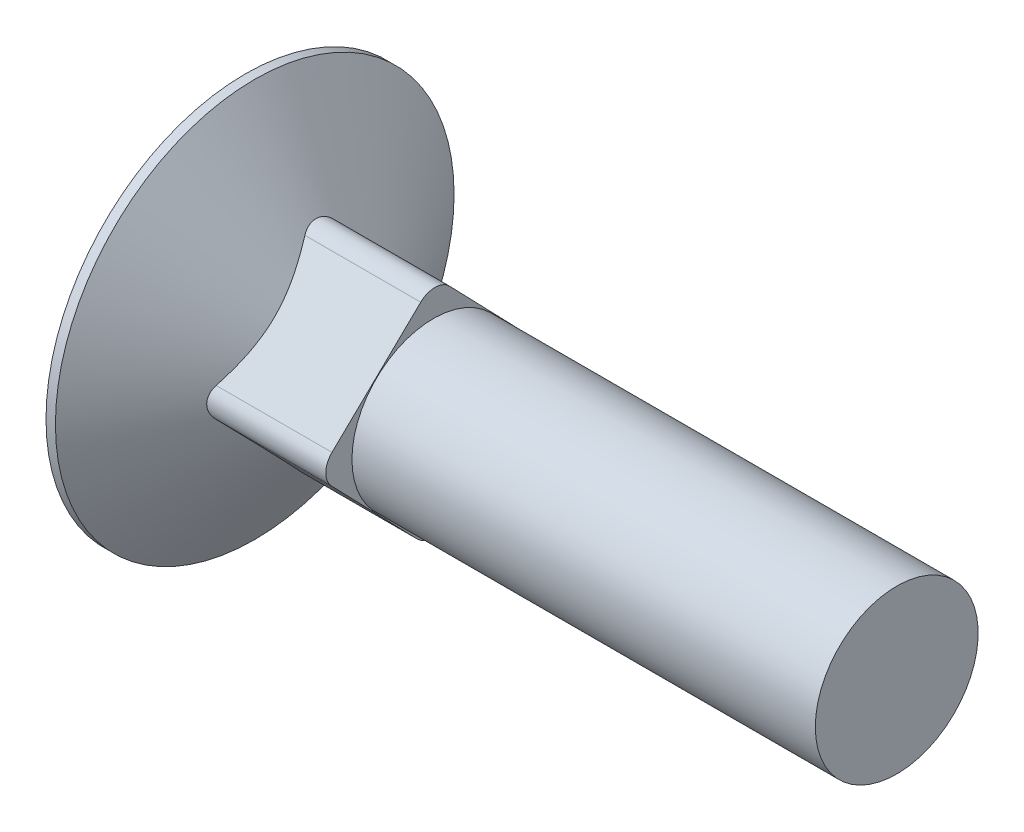
ISO-10303-21;
HEADER;
FILE_DESCRIPTION(('STEP AP214'),'2;1');
FILE_NAME('part.step','',(''),(''),'','','');
FILE_SCHEMA(('AUTOMOTIVE_DESIGN { 1 0 10303 214 1 1 1 1 }'));
ENDSEC;
DATA;
#1=APPLICATION_CONTEXT('core data for automotive mechanical design processes');
#2=APPLICATION_PROTOCOL_DEFINITION('international standard','automotive_design',2000,#1);
#3=PRODUCT_CONTEXT('',#1,'mechanical');
#4=PRODUCT('Part','Part','',(#3));
#5=PRODUCT_RELATED_PRODUCT_CATEGORY('part','',(#4));
#6=PRODUCT_DEFINITION_FORMATION('','',#4);
#7=PRODUCT_DEFINITION_CONTEXT('part definition',#1,'design');
#8=PRODUCT_DEFINITION('design','',#6,#7);
#9=PRODUCT_DEFINITION_SHAPE('','',#8);
#10=(LENGTH_UNIT() NAMED_UNIT(*) SI_UNIT(.MILLI.,.METRE.));
#11=(NAMED_UNIT(*) PLANE_ANGLE_UNIT() SI_UNIT($,.RADIAN.));
#12=(NAMED_UNIT(*) SI_UNIT($,.STERADIAN.) SOLID_ANGLE_UNIT());
#13=UNCERTAINTY_MEASURE_WITH_UNIT(LENGTH_MEASURE(1.E-05),#10,'distance_accuracy_value','');
#14=(GEOMETRIC_REPRESENTATION_CONTEXT(3) GLOBAL_UNCERTAINTY_ASSIGNED_CONTEXT((#13)) GLOBAL_UNIT_ASSIGNED_CONTEXT((#10,
#11,#12)) REPRESENTATION_CONTEXT('',''));
#15=CARTESIAN_POINT('',(0.,0.,0.));
#16=DIRECTION('',(0.,0.,1.));
#17=DIRECTION('',(1.,0.,0.));
#18=AXIS2_PLACEMENT_3D('',#15,#16,#17);
#19=CARTESIAN_POINT('',(0.550820296550669,0.,0.));
#20=DIRECTION('',(-1.,0.,0.));
#21=DIRECTION('',(0.,0.,1.));
#22=AXIS2_PLACEMENT_3D('',#19,#20,#21);
#23=CONICAL_SURFACE('',#22,11.6586,0.99483767363677);
#24=CARTESIAN_POINT('',(0.550820296550669,0.,0.));
#25=DIRECTION('',(-1.,0.,0.));
#26=DIRECTION('',(0.,0.,1.));
#27=AXIS2_PLACEMENT_3D('',#24,#25,#26);
#28=CIRCLE('',#27,11.6586);
#29=CARTESIAN_POINT('',(0.550820296550669,0.,11.6586));
#30=VERTEX_POINT('',#29);
#31=EDGE_CURVE('E133',#30,#30,#28,.T.);
#32=ORIENTED_EDGE('',*,*,#31,.F.);
#33=EDGE_LOOP('',(#32));
#34=FACE_BOUND('',#33,.T.);
#35=CARTESIAN_POINT('',(4.22248309683659,0.947568834934207,5.92949887114967));
#36=CARTESIAN_POINT('',(4.22248438139506,0.947571122348949,5.92949650246236));
#37=CARTESIAN_POINT('',(4.22248566595257,0.947573409763963,5.92949413377478));
#38=CARTESIAN_POINT('',(4.32284815381683,1.12628931816144,5.74442839307166));
#39=CARTESIAN_POINT('',(4.41731812936241,1.3066569752334,5.55765221654693));
#40=CARTESIAN_POINT('',(4.59027525263616,1.67116878949164,5.18018918314821));
#41=CARTESIAN_POINT('',(4.66875633483032,1.85531435081008,4.98950087225281));
#42=CARTESIAN_POINT('',(4.80418227689808,2.22697233379863,4.60463776450578));
#43=CARTESIAN_POINT('',(4.86118848153671,2.4144735375398,4.41047458415964));
#44=CARTESIAN_POINT('',(4.92662981337992,2.69789389232307,4.1169842152363));
#45=CARTESIAN_POINT('',(4.9450976620951,2.79271438242185,4.01879472337053));
#46=CARTESIAN_POINT('',(4.97481699163927,2.98289365180417,3.82185832487059));
#47=CARTESIAN_POINT('',(4.98606962730159,3.07825234247984,3.72311150999255));
#48=CARTESIAN_POINT('',(5.00156239145632,3.2766822108404,3.51763136614373));
#49=CARTESIAN_POINT('',(5.00518966349985,3.37977690077322,3.41087368952745));
#50=CARTESIAN_POINT('',(5.00348000544904,3.58593125786033,3.19739460344375));
#51=CARTESIAN_POINT('',(4.99814288955034,3.68899092424439,3.0906731947739));
#52=CARTESIAN_POINT('',(4.97871084625209,3.89476908505021,2.87758367134341));
#53=CARTESIAN_POINT('',(4.96461072221756,3.99748734064451,2.77121580389582));
#54=CARTESIAN_POINT('',(4.92818511680976,4.20220676501466,2.55922263413879));
#55=CARTESIAN_POINT('',(4.90585948067899,4.30420792026195,2.45359734583859));
#56=CARTESIAN_POINT('',(4.82748798957032,4.60941515972201,2.13754599738925));
#57=CARTESIAN_POINT('',(4.76011102909257,4.81123162421021,1.92855893058934));
#58=CARTESIAN_POINT('',(4.60229206329766,5.21026787820673,1.51534479327535));
#59=CARTESIAN_POINT('',(4.51185324666197,5.40748829908273,1.31111706896091));
#60=CARTESIAN_POINT('',(4.38274318829521,5.66239537127531,1.04715306850378));
#61=CARTESIAN_POINT('',(4.35166720856803,5.72199664545902,0.985434142345251));
#62=CARTESIAN_POINT('',(4.28810459207398,5.84077410652138,0.862436480822609));
#63=CARTESIAN_POINT('',(4.25561931990633,5.89995064268472,0.801157383763614));
#64=CARTESIAN_POINT('',(4.22248566595257,5.95895188124748,0.740059812676163));
#65=CARTESIAN_POINT('',(4.22248438139507,5.95895416866249,0.740057443988577));
#66=CARTESIAN_POINT('',(4.22248309683659,5.95895645607724,0.740055075301267));
#67=B_SPLINE_CURVE_WITH_KNOTS('',3,(#35,#36,#37,#38,#39,#40,#41,#42,#43,#44,#45,#46,#47,#48,#49,
#50,#51,#52,#53,#54,#55,#56,#57,#58,#59,#60,#61,#62,#63,#64,#65,#66),.UNSPECIFIED.,.F.,.F.,(4,2,
2,2,2,2,2,2,2,2,2,2,2,2,2,4),(0.,1.06036468604736E-05,0.828463634981272,1.65723036477948,
2.48361137065492,2.8966779658123,3.30967843094334,3.75477135228309,4.19987349915276,
4.6452398524854,5.09061458551495,5.98392039878694,6.87710276472493,7.15086040485315,
7.42435864042589,7.42436924407275),.UNSPECIFIED.);
#68=CARTESIAN_POINT('',(4.22259540928127,0.947768834934207,5.92929176508691));
#69=VERTEX_POINT('',#68);
#70=CARTESIAN_POINT('',(4.22259540928127,5.95875645607724,0.740262181364026));
#71=VERTEX_POINT('',#70);
#72=EDGE_CURVE('E47',#69,#71,#67,.T.);
#73=ORIENTED_EDGE('',*,*,#72,.T.);
#74=CARTESIAN_POINT('',(4.37014721321593,5.69985032690685,0.943136150924053));
#75=CARTESIAN_POINT('',(4.34324227212444,5.74630541437878,0.916161349937305));
#76=CARTESIAN_POINT('',(4.31737057595436,5.79141573778635,0.88572680002641));
#77=CARTESIAN_POINT('',(4.26806164216552,5.87802608257788,0.818098667074905));
#78=CARTESIAN_POINT('',(4.24463327878195,5.91951286021072,0.78088170840586));
#79=CARTESIAN_POINT('',(4.19884349338471,6.00105230453256,0.696483477664649));
#80=CARTESIAN_POINT('',(4.17675768151969,6.04065700764636,0.648713363506464));
#81=CARTESIAN_POINT('',(4.13679130178195,6.11255311127426,0.546442113838339));
#82=CARTESIAN_POINT('',(4.11890635436872,6.14485212689749,0.491948079487483));
#83=CARTESIAN_POINT('',(4.08784061693062,6.20089078040594,0.377146542352399));
#84=CARTESIAN_POINT('',(4.074680426633,6.22459294088776,0.316815003971383));
#85=CARTESIAN_POINT('',(4.0536865748734,6.2620253590223,0.192230504383717));
#86=CARTESIAN_POINT('',(4.04585257163797,6.27575625651985,0.127977795081107));
#87=CARTESIAN_POINT('',(4.03616202084214,6.2919412068429,0.00178023868278876));
#88=CARTESIAN_POINT('',(4.03395935709815,6.29505240748375,-0.0600542532917454));
#89=CARTESIAN_POINT('',(4.03460704892916,6.29166788865208,-0.183425580098465));
#90=CARTESIAN_POINT('',(4.03745634749913,6.28517417882969,-0.244962474494887));
#91=CARTESIAN_POINT('',(4.04790597437062,6.26328268852452,-0.363741134377618));
#92=CARTESIAN_POINT('',(4.05533558693759,6.24820628105391,-0.421057842102524));
#93=CARTESIAN_POINT('',(4.07452576779975,6.21006900852314,-0.532164216865608));
#94=CARTESIAN_POINT('',(4.08628534953391,6.18700996233741,-0.585954684053149));
#95=CARTESIAN_POINT('',(4.11572201771637,6.13004206716123,-0.696108824797507));
#96=CARTESIAN_POINT('',(4.13400145163864,6.09505887394084,-0.751757282500954));
#97=CARTESIAN_POINT('',(4.17510500418738,6.01742466311289,-0.855657395748282));
#98=CARTESIAN_POINT('',(4.19794009262019,5.97475516178265,-0.903890689678223));
#99=CARTESIAN_POINT('',(4.25129812881806,5.87636510602433,-0.998850151285309));
#100=CARTESIAN_POINT('',(4.28246388522523,5.81964672118477,-1.04418915426169));
#101=CARTESIAN_POINT('',(4.33216270300526,5.73066092924312,-1.10327230971032));
#102=CARTESIAN_POINT('',(4.34919495974103,5.7003924024824,-1.12146002525783));
#103=CARTESIAN_POINT('',(4.38413814474458,5.63879812941363,-1.15489504509219));
#104=CARTESIAN_POINT('',(4.40204831017735,5.60747330808014,-1.17014484731422));
#105=CARTESIAN_POINT('',(4.42035485245712,5.57572696349052,-1.18394128932733));
#106=B_SPLINE_CURVE_WITH_KNOTS('',3,(#74,#75,#76,#77,#78,#79,#80,#81,#82,#83,#84,#85,#86,#87,
#88,#89,#90,#91,#92,#93,#94,#95,#96,#97,#98,#99,#100,#101,#102,#103,#104,#105),.UNSPECIFIED.,
.F.,.F.,(4,2,2,2,2,2,2,2,2,2,2,2,2,2,2,4),(0.,0.180192585993531,0.361018374179981,
0.557766934637586,0.754309458634945,0.951698780586998,1.14907543516667,1.33399245257038,
1.51887078497551,1.69724330079825,1.87557520049025,2.07917372285048,2.28326855055709,
2.51893298149347,2.63643899183836,2.75384464847378),.UNSPECIFIED.);
#107=CARTESIAN_POINT('',(4.22259540928127,5.92929176508691,-0.947768834934208));
#108=VERTEX_POINT('',#107);
#109=EDGE_CURVE('E11',#71,#108,#106,.T.);
#110=ORIENTED_EDGE('',*,*,#109,.T.);
#111=CARTESIAN_POINT('',(0.495681040585581,11.044280820523,3.99171867916148));
#112=CARTESIAN_POINT('',(0.659605593270352,10.8452862852902,3.79955189023921));
#113=CARTESIAN_POINT('',(0.822787116952921,10.6459718954734,3.60707622133557));
#114=CARTESIAN_POINT('',(1.14720943469648,10.2465056021159,3.22131610592646));
#115=CARTESIAN_POINT('',(1.30845006491356,10.0463536297648,3.02803159297149));
#116=CARTESIAN_POINT('',(1.62912676478979,9.64427218477825,2.6397460549898));
#117=CARTESIAN_POINT('',(1.78855345174969,9.44233883206295,2.44474128301347));
#118=CARTESIAN_POINT('',(2.10426994280604,9.03721561056975,2.05351833560382));
#119=CARTESIAN_POINT('',(2.26055987044069,8.83402579169047,1.85730020835701));
#120=CARTESIAN_POINT('',(2.5809664770248,8.41032088945218,1.44813314043476));
#121=CARTESIAN_POINT('',(2.74475756497043,8.18967785640475,1.23506064018147));
#122=CARTESIAN_POINT('',(3.06594554778694,7.74595132420984,0.806558908956774));
#123=CARTESIAN_POINT('',(3.22334159948062,7.5228675081384,0.591129371935464));
#124=CARTESIAN_POINT('',(3.52896747014695,7.07387869176044,0.157545911945348));
#125=CARTESIAN_POINT('',(3.67721157511006,6.84797878581161,-0.0606030914594106));
#126=CARTESIAN_POINT('',(3.88995700175553,6.50605627837741,-0.390793818742508));
#127=CARTESIAN_POINT('',(3.95926260525405,6.39158094371092,-0.501341364422219));
#128=CARTESIAN_POINT('',(4.0939884470475,6.16145651958775,-0.723569937606912));
#129=CARTESIAN_POINT('',(4.15940896956308,6.0458075167196,-0.835250881494311));
#130=CARTESIAN_POINT('',(4.27305421121508,5.83624577241366,-1.03762230559955));
#131=CARTESIAN_POINT('',(4.32211697007454,5.74256862930014,-1.12808527116028));
#132=CARTESIAN_POINT('',(4.41671780322098,5.55430899870794,-1.30988548317248));
#133=CARTESIAN_POINT('',(4.46225634678265,5.45972663365729,-1.4012226113966));
#134=CARTESIAN_POINT('',(4.54924236238918,5.26958492621445,-1.5848403238968));
#135=CARTESIAN_POINT('',(4.59068982838876,5.17402558237884,-1.67712090956679));
#136=CARTESIAN_POINT('',(4.66886558930839,4.98187158797548,-1.86268186499645));
#137=CARTESIAN_POINT('',(4.70559160483757,4.88527646155764,-1.95596269427923));
#138=CARTESIAN_POINT('',(4.80638749516394,4.59741609245913,-2.23394622142948));
#139=CARTESIAN_POINT('',(4.86268595006732,4.40465761067181,-2.42009092354035));
#140=CARTESIAN_POINT('',(4.92734090813,4.11332934835743,-2.7014233562414));
#141=CARTESIAN_POINT('',(4.94559284681815,4.01586576184731,-2.79554284768666));
#142=CARTESIAN_POINT('',(4.97498416381651,3.82039062156011,-2.98431099641585));
#143=CARTESIAN_POINT('',(4.98612475118575,3.72237916379107,-3.07895956098589));
#144=CARTESIAN_POINT('',(5.00155201998298,3.51777026607202,-3.27654807673882));
#145=CARTESIAN_POINT('',(5.00518048121502,3.41114669757963,-3.3795132599618));
#146=CARTESIAN_POINT('',(5.00349577655758,3.19794970444493,-3.5853952030546));
#147=CARTESIAN_POINT('',(4.99818364465874,3.09137627542973,-3.68831196714728));
#148=CARTESIAN_POINT('',(4.97882504967027,2.87858172590384,-3.89380527496456));
#149=CARTESIAN_POINT('',(4.96477348937265,2.77236084738888,-3.9963815849966));
#150=CARTESIAN_POINT('',(4.92846492200668,2.56065545050578,-4.20082311033268));
#151=CARTESIAN_POINT('',(4.90620752825576,2.45517096707743,-4.30268829189577));
#152=CARTESIAN_POINT('',(4.82792355120154,2.13896530825003,-4.60804454715587));
#153=CARTESIAN_POINT('',(4.76050815914816,1.9296878617625,-4.81014142804916));
#154=CARTESIAN_POINT('',(4.60253889844864,1.51590187615352,-5.20972990952423));
#155=CARTESIAN_POINT('',(4.51198767176197,1.31139279542414,-5.40722203313071));
#156=CARTESIAN_POINT('',(4.38271157994658,1.047088171023,-5.66245804204449));
#157=CARTESIAN_POINT('',(4.35160275952971,0.985305379627326,-5.72212099017154));
#158=CARTESIAN_POINT('',(4.28803700423806,0.862309749354663,-5.84089648967618));
#159=CARTESIAN_POINT('',(4.2555844165455,0.801095753712041,-5.90001015812935));
#160=CARTESIAN_POINT('',(4.12371643932472,0.557923852901268,-6.13483853309081));
#161=CARTESIAN_POINT('',(4.01920287406725,0.377392309263706,-6.3091758182802));
#162=CARTESIAN_POINT('',(3.80165547976134,0.0189931305149182,-6.65527788209797));
#163=CARTESIAN_POINT('',(3.68861970542927,-0.15887388521588,-6.82704206259764));
#164=CARTESIAN_POINT('',(3.45601586715288,-0.512631422361394,-7.16866174522246));
#165=CARTESIAN_POINT('',(3.33644025374842,-0.688519364329062,-7.33851475640456));
#166=CARTESIAN_POINT('',(3.09241622682978,-1.0385100795917,-7.67649686142038));
#167=CARTESIAN_POINT('',(2.96796822983632,-1.21261300388207,-7.84462610106868));
#168=CARTESIAN_POINT('',(2.71352006285851,-1.56181965907238,-8.1818510480739));
#169=CARTESIAN_POINT('',(2.58346651806181,-1.73690320914336,-8.35092726703081));
#170=CARTESIAN_POINT('',(2.3203053943893,-2.08588411042287,-8.68793420601848));
#171=CARTESIAN_POINT('',(2.18719770436412,-2.25978141816081,-8.85586488407019));
#172=CARTESIAN_POINT('',(1.91895844977538,-2.60609020260489,-9.19029138982492));
#173=CARTESIAN_POINT('',(1.78383404226921,-2.77850455377696,-9.35678999336743));
#174=CARTESIAN_POINT('',(1.51163147270664,-3.12251335868479,-9.68899543470172));
#175=CARTESIAN_POINT('',(1.37455348771856,-3.29410788486896,-9.85470234245612));
#176=CARTESIAN_POINT('',(1.23671318175408,-3.46538144504418,-10.0200992969386));
#177=B_SPLINE_CURVE_WITH_KNOTS('',3,(#111,#112,#113,#114,#115,#116,#117,#118,#119,#120,#121,
#122,#123,#124,#125,#126,#127,#128,#129,#130,#131,#132,#133,#134,#135,#136,#137,#138,#139,#140,
#141,#142,#143,#144,#145,#146,#147,#148,#149,#150,#151,#152,#153,#154,#155,#156,#157,#158,#159,
#160,#161,#162,#163,#164,#165,#166,#167,#168,#169,#170,#171,#172,#173,#174,#175,#176),
.UNSPECIFIED.,.F.,.F.,(4,2,2,2,2,2,2,2,2,2,2,2,2,2,2,2,2,2,2,2,2,2,2,2,2,2,2,2,2,2,2,2,4),(0.,
0.964671927295264,1.92942472588234,2.89790611186204,3.86634928000356,4.90945835241618,
5.9527045140249,6.99427871749752,7.51496760216722,8.03561834778448,8.45306191055756,
8.87044979172526,9.28783828964721,9.70542754093602,10.5255878267223,10.935577093343,
11.3454966357539,11.790031789242,12.2345155352235,12.6792587665354,13.1240229581116,
14.018526544747,14.9129280306001,15.1869685485165,15.4601828644386,16.275517718679,
17.0910392484204,17.9075229307919,18.7239369669677,19.551795107665,20.3796834245033,
21.2051211470469,22.0304845234866),.UNSPECIFIED.);
#178=CARTESIAN_POINT('',(4.22259540928127,0.740262181364026,-5.95875645607724));
#179=VERTEX_POINT('',#178);
#180=EDGE_CURVE('E138',#108,#179,#177,.T.);
#181=ORIENTED_EDGE('',*,*,#180,.T.);
#182=CARTESIAN_POINT('',(4.37014721321593,0.943136150924055,-5.69985032690685));
#183=CARTESIAN_POINT('',(4.34324227212444,0.916161349937306,-5.74630541437877));
#184=CARTESIAN_POINT('',(4.31737057595436,0.885726800026411,-5.79141573778635));
#185=CARTESIAN_POINT('',(4.26806164216552,0.818098667074907,-5.87802608257788));
#186=CARTESIAN_POINT('',(4.24463327878195,0.780881708405861,-5.91951286021072));
#187=CARTESIAN_POINT('',(4.19884349338471,0.69648347766465,-6.00105230453256));
#188=CARTESIAN_POINT('',(4.17675768151969,0.648713363506465,-6.04065700764636));
#189=CARTESIAN_POINT('',(4.13679130178195,0.54644211383834,-6.11255311127426));
#190=CARTESIAN_POINT('',(4.11890635436873,0.491948079487484,-6.14485212689748));
#191=CARTESIAN_POINT('',(4.08784061693062,0.377146542352399,-6.20089078040594));
#192=CARTESIAN_POINT('',(4.07468042663301,0.316815003971384,-6.22459294088776));
#193=CARTESIAN_POINT('',(4.0536865748734,0.192230504383717,-6.26202535902229));
#194=CARTESIAN_POINT('',(4.04585257163797,0.127977795081107,-6.27575625651985));
#195=CARTESIAN_POINT('',(4.03616202084214,0.00178023868278865,-6.2919412068429));
#196=CARTESIAN_POINT('',(4.03395935709815,-0.0600542532917456,-6.29505240748375));
#197=CARTESIAN_POINT('',(4.03460704892917,-0.183425580098465,-6.29166788865207));
#198=CARTESIAN_POINT('',(4.03745634749913,-0.244962474494887,-6.28517417882969));
#199=CARTESIAN_POINT('',(4.04790597437063,-0.363741134377618,-6.26328268852452));
#200=CARTESIAN_POINT('',(4.05533558693759,-0.421057842102524,-6.2482062810539));
#201=CARTESIAN_POINT('',(4.07452576779975,-0.532164216865608,-6.21006900852314));
#202=CARTESIAN_POINT('',(4.08628534953391,-0.58595468405315,-6.18700996233741));
#203=CARTESIAN_POINT('',(4.11572201771637,-0.696108824797508,-6.13004206716123));
#204=CARTESIAN_POINT('',(4.13400145163864,-0.751757282500954,-6.09505887394084));
#205=CARTESIAN_POINT('',(4.17510500418738,-0.855657395748282,-6.01742466311289));
#206=CARTESIAN_POINT('',(4.19794009262019,-0.903890689678222,-5.97475516178265));
#207=CARTESIAN_POINT('',(4.25129812881806,-0.998850151285309,-5.87636510602433));
#208=CARTESIAN_POINT('',(4.28246388522523,-1.04418915426169,-5.81964672118477));
#209=CARTESIAN_POINT('',(4.33216270300526,-1.10327230971032,-5.73066092924312));
#210=CARTESIAN_POINT('',(4.34919495974103,-1.12146002525783,-5.7003924024824));
#211=CARTESIAN_POINT('',(4.38413814474458,-1.15489504509219,-5.63879812941363));
#212=CARTESIAN_POINT('',(4.40204831017735,-1.17014484731422,-5.60747330808014));
#213=CARTESIAN_POINT('',(4.42035485245712,-1.18394128932733,-5.57572696349052));
#214=B_SPLINE_CURVE_WITH_KNOTS('',3,(#182,#183,#184,#185,#186,#187,#188,#189,#190,#191,#192,
#193,#194,#195,#196,#197,#198,#199,#200,#201,#202,#203,#204,#205,#206,#207,#208,#209,#210,#211,
#212,#213),.UNSPECIFIED.,.F.,.F.,(4,2,2,2,2,2,2,2,2,2,2,2,2,2,2,4),(0.,0.180192585993531,
0.361018374179982,0.557766934637587,0.754309458634947,0.951698780587,1.14907543516667,
1.33399245257038,1.51887078497551,1.69724330079826,1.87557520049025,2.07917372285048,
2.28326855055709,2.51893298149347,2.63643899183836,2.75384464847379),.UNSPECIFIED.);
#215=CARTESIAN_POINT('',(4.22259540928127,-0.947768834934208,-5.92929176508691));
#216=VERTEX_POINT('',#215);
#217=EDGE_CURVE('E147',#179,#216,#214,.T.);
#218=ORIENTED_EDGE('',*,*,#217,.T.);
#219=CARTESIAN_POINT('',(4.22248309683659,-0.947568834934208,-5.92949887114967));
#220=CARTESIAN_POINT('',(4.22248438139506,-0.94757112234895,-5.92949650246236));
#221=CARTESIAN_POINT('',(4.22248566595257,-0.947573409763963,-5.92949413377478));
#222=CARTESIAN_POINT('',(4.32284815382542,-1.12628931816263,-5.7444283930784));
#223=CARTESIAN_POINT('',(4.41731812936435,-1.30665697523301,-5.55765221654947));
#224=CARTESIAN_POINT('',(4.59027525263315,-1.67116878948976,-5.18018918314803));
#225=CARTESIAN_POINT('',(4.66875633482902,-1.8553143508083,-4.9895008722541));
#226=CARTESIAN_POINT('',(4.80418227689823,-2.22697233379726,-4.60463776450776));
#227=CARTESIAN_POINT('',(4.86118848153655,-2.41447353753876,-4.41047458416081));
#228=CARTESIAN_POINT('',(4.92662981337975,-2.69789389232254,-4.1169842152368));
#229=CARTESIAN_POINT('',(4.94509766209501,-2.79271438242143,-4.01879472337095));
#230=CARTESIAN_POINT('',(4.97481699163926,-2.98289365180397,-3.82185832487081));
#231=CARTESIAN_POINT('',(4.98606962730159,-3.07825234247974,-3.72311150999266));
#232=CARTESIAN_POINT('',(5.00156239145633,-3.27668221084056,-3.51763136614355));
#233=CARTESIAN_POINT('',(5.00518966349986,-3.37977690077355,-3.41087368952711));
#234=CARTESIAN_POINT('',(5.00348000544902,-3.58593125786099,-3.19739460344306));
#235=CARTESIAN_POINT('',(4.99814288955029,-3.68899092424523,-3.09067319477304));
#236=CARTESIAN_POINT('',(4.97871084625195,-3.89476908505143,-2.87758367134214));
#237=CARTESIAN_POINT('',(4.96461072221736,-3.99748734064594,-2.77121580389432));
#238=CARTESIAN_POINT('',(4.92818511680938,-4.20220676501653,-2.55922263413686));
#239=CARTESIAN_POINT('',(4.9058594806785,-4.30420792026405,-2.45359734583646));
#240=CARTESIAN_POINT('',(4.82748798956975,-4.60941515972387,-2.13754599738723));
#241=CARTESIAN_POINT('',(4.76011102909221,-4.81123162421153,-1.92855893058749));
#242=CARTESIAN_POINT('',(4.60229206329713,-5.21026787820766,-1.51534479327486));
#243=CARTESIAN_POINT('',(4.51185324666106,-5.40748829908381,-1.31111706896161));
#244=CARTESIAN_POINT('',(4.38274318829544,-5.66239537127508,-1.04715306850347));
#245=CARTESIAN_POINT('',(4.35166720856861,-5.72199664545844,-0.985434142344444));
#246=CARTESIAN_POINT('',(4.28810459207344,-5.8407741065219,-0.862436480823475));
#247=CARTESIAN_POINT('',(4.25561931990431,-5.89995064268669,-0.801157383766643));
#248=CARTESIAN_POINT('',(4.22248566595257,-5.95895188124748,-0.740059812676164));
#249=CARTESIAN_POINT('',(4.22248438139507,-5.95895416866249,-0.740057443988577));
#250=CARTESIAN_POINT('',(4.22248309683659,-5.95895645607724,-0.740055075301267));
#251=B_SPLINE_CURVE_WITH_KNOTS('',3,(#219,#220,#221,#222,#223,#224,#225,#226,#227,#228,#229,
#230,#231,#232,#233,#234,#235,#236,#237,#238,#239,#240,#241,#242,#243,#244,#245,#246,#247,#248,
#249,#250),.UNSPECIFIED.,.F.,.F.,(4,2,2,2,2,2,2,2,2,2,2,2,2,2,2,4),(0.,1.06036468595415E-05,
0.82846363497939,1.65723036477667,2.483611370654,2.89667796581186,3.30967843094333,
3.7547713522838,4.1998734991542,4.64523985248779,5.0906145855183,5.98392039878863,
6.87710276472493,7.15086040485309,7.42435864042589,7.42436924407275),.UNSPECIFIED.);
#252=CARTESIAN_POINT('',(4.22259540928127,-5.95875645607724,-0.740262181364027));
#253=VERTEX_POINT('',#252);
#254=EDGE_CURVE('E173',#216,#253,#251,.T.);
#255=ORIENTED_EDGE('',*,*,#254,.T.);
#256=CARTESIAN_POINT('',(4.37014721321593,-5.69985032690685,-0.943136150924055));
#257=CARTESIAN_POINT('',(4.34324227212444,-5.74630541437878,-0.916161349937306));
#258=CARTESIAN_POINT('',(4.31737057595436,-5.79141573778635,-0.885726800026411));
#259=CARTESIAN_POINT('',(4.26806164216552,-5.87802608257788,-0.818098667074906));
#260=CARTESIAN_POINT('',(4.24463327878195,-5.91951286021072,-0.780881708405861));
#261=CARTESIAN_POINT('',(4.19884349338471,-6.00105230453256,-0.69648347766465));
#262=CARTESIAN_POINT('',(4.17675768151969,-6.04065700764636,-0.648713363506465));
#263=CARTESIAN_POINT('',(4.13679130178195,-6.11255311127426,-0.54644211383834));
#264=CARTESIAN_POINT('',(4.11890635436872,-6.14485212689749,-0.491948079487484));
#265=CARTESIAN_POINT('',(4.08784061693062,-6.20089078040594,-0.377146542352399));
#266=CARTESIAN_POINT('',(4.07468042663301,-6.22459294088776,-0.316815003971384));
#267=CARTESIAN_POINT('',(4.0536865748734,-6.2620253590223,-0.192230504383717));
#268=CARTESIAN_POINT('',(4.04585257163797,-6.27575625651985,-0.127977795081108));
#269=CARTESIAN_POINT('',(4.03616202084214,-6.2919412068429,-0.00178023868278952));
#270=CARTESIAN_POINT('',(4.03395935709815,-6.29505240748375,0.0600542532917447));
#271=CARTESIAN_POINT('',(4.03460704892916,-6.29166788865208,0.183425580098464));
#272=CARTESIAN_POINT('',(4.03745634749913,-6.28517417882969,0.244962474494886));
#273=CARTESIAN_POINT('',(4.04790597437062,-6.26328268852452,0.363741134377618));
#274=CARTESIAN_POINT('',(4.05533558693758,-6.24820628105391,0.421057842102523));
#275=CARTESIAN_POINT('',(4.07452576779975,-6.21006900852314,0.532164216865608));
#276=CARTESIAN_POINT('',(4.08628534953391,-6.18700996233741,0.585954684053149));
#277=CARTESIAN_POINT('',(4.11572201771637,-6.13004206716123,0.696108824797507));
#278=CARTESIAN_POINT('',(4.13400145163864,-6.09505887394084,0.751757282500954));
#279=CARTESIAN_POINT('',(4.17510500418737,-6.01742466311289,0.855657395748282));
#280=CARTESIAN_POINT('',(4.19794009262019,-5.97475516178265,0.903890689678223));
#281=CARTESIAN_POINT('',(4.25129812881806,-5.87636510602433,0.998850151285309));
#282=CARTESIAN_POINT('',(4.28246388522523,-5.81964672118477,1.04418915426169));
#283=CARTESIAN_POINT('',(4.33216270300526,-5.73066092924312,1.10327230971032));
#284=CARTESIAN_POINT('',(4.34919495974103,-5.7003924024824,1.12146002525783));
#285=CARTESIAN_POINT('',(4.38413814474458,-5.63879812941363,1.15489504509219));
#286=CARTESIAN_POINT('',(4.40204831017735,-5.60747330808014,1.17014484731422));
#287=CARTESIAN_POINT('',(4.42035485245711,-5.57572696349052,1.18394128932733));
#288=B_SPLINE_CURVE_WITH_KNOTS('',3,(#256,#257,#258,#259,#260,#261,#262,#263,#264,#265,#266,
#267,#268,#269,#270,#271,#272,#273,#274,#275,#276,#277,#278,#279,#280,#281,#282,#283,#284,#285,
#286,#287),.UNSPECIFIED.,.F.,.F.,(4,2,2,2,2,2,2,2,2,2,2,2,2,2,2,4),(0.,0.180192585993532,
0.361018374179983,0.557766934637588,0.754309458634947,0.951698780586999,1.14907543516667,
1.33399245257038,1.51887078497551,1.69724330079826,1.87557520049025,2.07917372285048,
2.28326855055709,2.51893298149347,2.63643899183836,2.75384464847378),.UNSPECIFIED.);
#289=CARTESIAN_POINT('',(4.22259540928127,-5.92929176508691,0.947768834934208));
#290=VERTEX_POINT('',#289);
#291=EDGE_CURVE('E180',#253,#290,#288,.T.);
#292=ORIENTED_EDGE('',*,*,#291,.T.);
#293=CARTESIAN_POINT('',(0.495681040585581,-11.044280820523,-3.99171867916148));
#294=CARTESIAN_POINT('',(0.659605593270353,-10.8452862852902,-3.79955189023921));
#295=CARTESIAN_POINT('',(0.822787116952922,-10.6459718954734,-3.60707622133557));
#296=CARTESIAN_POINT('',(1.14720943469648,-10.2465056021159,-3.22131610592647));
#297=CARTESIAN_POINT('',(1.30845006491356,-10.0463536297648,-3.02803159297149));
#298=CARTESIAN_POINT('',(1.62912676478979,-9.64427218477825,-2.6397460549898));
#299=CARTESIAN_POINT('',(1.78855345174969,-9.44233883206295,-2.44474128301348));
#300=CARTESIAN_POINT('',(2.10426994280603,-9.03721561056976,-2.05351833560382));
#301=CARTESIAN_POINT('',(2.26055987044069,-8.83402579169047,-1.85730020835701));
#302=CARTESIAN_POINT('',(2.5809664770248,-8.41032088945219,-1.44813314043477));
#303=CARTESIAN_POINT('',(2.74475756497043,-8.18967785640475,-1.23506064018147));
#304=CARTESIAN_POINT('',(3.06594554778694,-7.74595132420984,-0.806558908956776));
#305=CARTESIAN_POINT('',(3.22334159948062,-7.5228675081384,-0.591129371935465));
#306=CARTESIAN_POINT('',(3.52896747014695,-7.07387869176044,-0.15754591194535));
#307=CARTESIAN_POINT('',(3.67721157511006,-6.84797878581161,0.0606030914594095));
#308=CARTESIAN_POINT('',(3.88995700175553,-6.50605627837741,0.390793818742507));
#309=CARTESIAN_POINT('',(3.95926260525405,-6.39158094371092,0.501341364422218));
#310=CARTESIAN_POINT('',(4.0939884470475,-6.16145651958775,0.723569937606912));
#311=CARTESIAN_POINT('',(4.15940896956308,-6.0458075167196,0.83525088149431));
#312=CARTESIAN_POINT('',(4.27305421121508,-5.83624577241366,1.03762230559955));
#313=CARTESIAN_POINT('',(4.32211697007454,-5.74256862930014,1.12808527116028));
#314=CARTESIAN_POINT('',(4.41671780322098,-5.55430899870794,1.30988548317248));
#315=CARTESIAN_POINT('',(4.46225634678265,-5.45972663365729,1.4012226113966));
#316=CARTESIAN_POINT('',(4.54924236238918,-5.26958492621445,1.58484032389681));
#317=CARTESIAN_POINT('',(4.59068982838876,-5.17402558237884,1.67712090956679));
#318=CARTESIAN_POINT('',(4.66886558930839,-4.98187158797548,1.86268186499645));
#319=CARTESIAN_POINT('',(4.70559160483757,-4.88527646155764,1.95596269427923));
#320=CARTESIAN_POINT('',(4.80638749516394,-4.59741609245913,2.23394622142948));
#321=CARTESIAN_POINT('',(4.86268595006732,-4.40465761067181,2.42009092354035));
#322=CARTESIAN_POINT('',(4.92734090813,-4.11332934835743,2.7014233562414));
#323=CARTESIAN_POINT('',(4.94559284681815,-4.01586576184731,2.79554284768666));
#324=CARTESIAN_POINT('',(4.97498416381651,-3.82039062156011,2.98431099641585));
#325=CARTESIAN_POINT('',(4.98612475118575,-3.72237916379107,3.07895956098589));
#326=CARTESIAN_POINT('',(5.00155201998298,-3.51777026607202,3.27654807673882));
#327=CARTESIAN_POINT('',(5.00518048121502,-3.41114669757963,3.3795132599618));
#328=CARTESIAN_POINT('',(5.00349577655758,-3.19794970444493,3.5853952030546));
#329=CARTESIAN_POINT('',(4.99818364465874,-3.09137627542973,3.68831196714728));
#330=CARTESIAN_POINT('',(4.97882504967027,-2.87858172590384,3.89380527496456));
#331=CARTESIAN_POINT('',(4.96477348937265,-2.77236084738888,3.9963815849966));
#332=CARTESIAN_POINT('',(4.92846492200668,-2.56065545050578,4.20082311033269));
#333=CARTESIAN_POINT('',(4.90620752825576,-2.45517096707743,4.30268829189577));
#334=CARTESIAN_POINT('',(4.82792355120154,-2.13896530825003,4.60804454715587));
#335=CARTESIAN_POINT('',(4.76050815914816,-1.9296878617625,4.81014142804916));
#336=CARTESIAN_POINT('',(4.60253889844864,-1.51590187615353,5.20972990952423));
#337=CARTESIAN_POINT('',(4.51198767176197,-1.31139279542414,5.40722203313072));
#338=CARTESIAN_POINT('',(4.38271157994658,-1.047088171023,5.66245804204449));
#339=CARTESIAN_POINT('',(4.35160275952971,-0.985305379627326,5.72212099017155));
#340=CARTESIAN_POINT('',(4.28803700423806,-0.862309749354663,5.84089648967618));
#341=CARTESIAN_POINT('',(4.2555844165455,-0.801095753712041,5.90001015812935));
#342=CARTESIAN_POINT('',(4.12371643932472,-0.557923852901268,6.13483853309081));
#343=CARTESIAN_POINT('',(4.01920287406725,-0.377392309263705,6.3091758182802));
#344=CARTESIAN_POINT('',(3.80165547976134,-0.0189931305149163,6.65527788209798));
#345=CARTESIAN_POINT('',(3.68861970542926,0.158873885215882,6.82704206259764));
#346=CARTESIAN_POINT('',(3.45601586715288,0.512631422361395,7.16866174522246));
#347=CARTESIAN_POINT('',(3.33644025374842,0.688519364329062,7.33851475640456));
#348=CARTESIAN_POINT('',(3.09241622682978,1.03851007959169,7.67649686142038));
#349=CARTESIAN_POINT('',(2.96796822983632,1.21261300388207,7.84462610106868));
#350=CARTESIAN_POINT('',(2.71352006285851,1.56181965907238,8.1818510480739));
#351=CARTESIAN_POINT('',(2.58346651806181,1.73690320914336,8.35092726703081));
#352=CARTESIAN_POINT('',(2.3203053943893,2.08588411042287,8.68793420601849));
#353=CARTESIAN_POINT('',(2.18719770436412,2.25978141816081,8.85586488407019));
#354=CARTESIAN_POINT('',(1.91895844977538,2.60609020260489,9.19029138982492));
#355=CARTESIAN_POINT('',(1.78383404226921,2.77850455377695,9.35678999336743));
#356=CARTESIAN_POINT('',(1.51163147270664,3.12251335868479,9.68899543470172));
#357=CARTESIAN_POINT('',(1.37455348771856,3.29410788486896,9.85470234245612));
#358=CARTESIAN_POINT('',(1.23671318175408,3.46538144504418,10.0200992969386));
#359=B_SPLINE_CURVE_WITH_KNOTS('',3,(#293,#294,#295,#296,#297,#298,#299,#300,#301,#302,#303,
#304,#305,#306,#307,#308,#309,#310,#311,#312,#313,#314,#315,#316,#317,#318,#319,#320,#321,#322,
#323,#324,#325,#326,#327,#328,#329,#330,#331,#332,#333,#334,#335,#336,#337,#338,#339,#340,#341,
#342,#343,#344,#345,#346,#347,#348,#349,#350,#351,#352,#353,#354,#355,#356,#357,#358),
.UNSPECIFIED.,.F.,.F.,(4,2,2,2,2,2,2,2,2,2,2,2,2,2,2,2,2,2,2,2,2,2,2,2,2,2,2,2,2,2,2,2,4),(0.,
0.964671927295265,1.92942472588234,2.89790611186204,3.86634928000356,4.90945835241618,
5.95270451402489,6.99427871749752,7.51496760216722,8.03561834778448,8.45306191055756,
8.87044979172526,9.28783828964721,9.70542754093602,10.5255878267223,10.935577093343,
11.3454966357539,11.790031789242,12.2345155352235,12.6792587665354,13.1240229581116,
14.018526544747,14.9129280306001,15.1869685485165,15.4601828644386,16.275517718679,
17.0910392484204,17.9075229307919,18.7239369669677,19.551795107665,20.3796834245033,
21.2051211470469,22.0304845234866),.UNSPECIFIED.);
#360=CARTESIAN_POINT('',(4.22259540928127,-0.740262181364026,5.95875645607724));
#361=VERTEX_POINT('',#360);
#362=EDGE_CURVE('E187',#290,#361,#359,.T.);
#363=ORIENTED_EDGE('',*,*,#362,.T.);
#364=CARTESIAN_POINT('',(4.37014721321593,-0.943136150924056,5.69985032690685));
#365=CARTESIAN_POINT('',(4.34324227212444,-0.916161349937307,5.74630541437877));
#366=CARTESIAN_POINT('',(4.31737057595436,-0.885726800026411,5.79141573778635));
#367=CARTESIAN_POINT('',(4.26806164216552,-0.818098667074906,5.87802608257788));
#368=CARTESIAN_POINT('',(4.24463327878195,-0.780881708405861,5.91951286021072));
#369=CARTESIAN_POINT('',(4.19884349338471,-0.696483477664649,6.00105230453256));
#370=CARTESIAN_POINT('',(4.17675768151969,-0.648713363506464,6.04065700764636));
#371=CARTESIAN_POINT('',(4.13679130178195,-0.546442113838339,6.11255311127426));
#372=CARTESIAN_POINT('',(4.11890635436873,-0.491948079487483,6.14485212689748));
#373=CARTESIAN_POINT('',(4.08784061693062,-0.377146542352398,6.20089078040594));
#374=CARTESIAN_POINT('',(4.074680426633,-0.316815003971383,6.22459294088776));
#375=CARTESIAN_POINT('',(4.0536865748734,-0.192230504383716,6.26202535902229));
#376=CARTESIAN_POINT('',(4.04585257163797,-0.127977795081106,6.27575625651985));
#377=CARTESIAN_POINT('',(4.03616202084214,-0.00178023868278747,6.2919412068429));
#378=CARTESIAN_POINT('',(4.03395935709815,0.0600542532917468,6.29505240748375));
#379=CARTESIAN_POINT('',(4.03460704892916,0.183425580098466,6.29166788865207));
#380=CARTESIAN_POINT('',(4.03745634749913,0.244962474494888,6.28517417882969));
#381=CARTESIAN_POINT('',(4.04790597437063,0.363741134377619,6.26328268852452));
#382=CARTESIAN_POINT('',(4.05533558693759,0.421057842102524,6.2482062810539));
#383=CARTESIAN_POINT('',(4.07452576779975,0.532164216865609,6.21006900852313));
#384=CARTESIAN_POINT('',(4.08628534953391,0.58595468405315,6.18700996233741));
#385=CARTESIAN_POINT('',(4.11572201771637,0.696108824797509,6.13004206716123));
#386=CARTESIAN_POINT('',(4.13400145163864,0.751757282500955,6.09505887394084));
#387=CARTESIAN_POINT('',(4.17510500418738,0.855657395748282,6.01742466311289));
#388=CARTESIAN_POINT('',(4.19794009262019,0.903890689678222,5.97475516178265));
#389=CARTESIAN_POINT('',(4.25129812881806,0.998850151285309,5.87636510602433));
#390=CARTESIAN_POINT('',(4.28246388522523,1.04418915426169,5.81964672118477));
#391=CARTESIAN_POINT('',(4.33216270300526,1.10327230971032,5.73066092924312));
#392=CARTESIAN_POINT('',(4.34919495974103,1.12146002525783,5.7003924024824));
#393=CARTESIAN_POINT('',(4.38413814474458,1.15489504509219,5.63879812941363));
#394=CARTESIAN_POINT('',(4.40204831017735,1.17014484731422,5.60747330808014));
#395=CARTESIAN_POINT('',(4.42035485245712,1.18394128932732,5.57572696349052));
#396=B_SPLINE_CURVE_WITH_KNOTS('',3,(#364,#365,#366,#367,#368,#369,#370,#371,#372,#373,#374,
#375,#376,#377,#378,#379,#380,#381,#382,#383,#384,#385,#386,#387,#388,#389,#390,#391,#392,#393,
#394,#395),.UNSPECIFIED.,.F.,.F.,(4,2,2,2,2,2,2,2,2,2,2,2,2,2,2,4),(0.,0.180192585993533,
0.361018374179985,0.55776693463759,0.754309458634949,0.951698780587003,1.14907543516668,
1.33399245257038,1.51887078497551,1.69724330079826,1.87557520049025,2.07917372285049,
2.2832685505571,2.51893298149347,2.63643899183836,2.75384464847379),.UNSPECIFIED.);
#397=EDGE_CURVE('E194',#361,#69,#396,.T.);
#398=ORIENTED_EDGE('',*,*,#397,.T.);
#399=EDGE_LOOP('',(#73,#110,#181,#218,#255,#292,#363,#398));
#400=FACE_BOUND('',#399,.T.);
#401=ADVANCED_FACE('F33',(#34,#400),#23,.T.);
#402=CARTESIAN_POINT('',(0.,0.,0.));
#403=DIRECTION('',(-1.,0.,0.));
#404=DIRECTION('',(0.,0.,1.));
#405=AXIS2_PLACEMENT_3D('',#402,#403,#404);
#406=PLANE('',#405);
#407=CARTESIAN_POINT('',(0.,0.,0.));
#408=DIRECTION('',(-1.,0.,0.));
#409=DIRECTION('',(0.,0.,1.));
#410=AXIS2_PLACEMENT_3D('',#407,#408,#409);
#411=CIRCLE('',#410,11.6586);
#412=CARTESIAN_POINT('',(0.,0.,11.6586));
#413=VERTEX_POINT('',#412);
#414=EDGE_CURVE('E136',#413,#413,#411,.T.);
#415=ORIENTED_EDGE('',*,*,#414,.T.);
#416=EDGE_LOOP('',(#415));
#417=FACE_BOUND('',#416,.T.);
#418=ADVANCED_FACE('F35',(#417),#406,.T.);
#419=CARTESIAN_POINT('',(-6.34999999999999,0.,0.));
#420=DIRECTION('',(-1.,0.,0.));
#421=DIRECTION('',(0.,0.,1.));
#422=AXIS2_PLACEMENT_3D('',#419,#420,#421);
#423=CYLINDRICAL_SURFACE('',#422,11.6586);
#424=ORIENTED_EDGE('',*,*,#31,.T.);
#425=EDGE_LOOP('',(#424));
#426=FACE_BOUND('',#425,.T.);
#427=ORIENTED_EDGE('',*,*,#414,.F.);
#428=EDGE_LOOP('',(#427));
#429=FACE_BOUND('',#428,.T.);
#430=ADVANCED_FACE('F260',(#426,#429),#423,.T.);
#431=CARTESIAN_POINT('',(10.9982,5.10000860243296,-0.0890209812899273));
#432=DIRECTION('',(-1.,0.,0.));
#433=DIRECTION('',(0.,0.,1.));
#434=AXIS2_PLACEMENT_3D('',#431,#432,#433);
#435=CYLINDRICAL_SURFACE('',#434,1.1938);
#436=ORIENTED_EDGE('',*,*,#109,.F.);
#437=DIRECTION('',(-1.,0.,0.));
#438=VECTOR('',#437,1.);
#439=CARTESIAN_POINT('',(10.9982,5.95875645607724,0.740262181364026));
#440=LINE('',#439,#438);
#441=CARTESIAN_POINT('',(10.9982,5.95875645607724,0.740262181364026));
#442=VERTEX_POINT('',#441);
#443=EDGE_CURVE('E107',#442,#71,#440,.T.);
#444=ORIENTED_EDGE('',*,*,#443,.F.);
#445=CARTESIAN_POINT('',(10.9982,5.10000860243296,-0.0890209812899273));
#446=DIRECTION('',(1.,0.,0.));
#447=DIRECTION('',(0.,0.,1.));
#448=AXIS2_PLACEMENT_3D('',#445,#446,#447);
#449=CIRCLE('',#448,1.1938);
#450=CARTESIAN_POINT('',(10.9982,5.92929176508691,-0.947768834934208));
#451=VERTEX_POINT('',#450);
#452=EDGE_CURVE('E114',#451,#442,#449,.T.);
#453=ORIENTED_EDGE('',*,*,#452,.F.);
#454=DIRECTION('',(-1.,0.,0.));
#455=VECTOR('',#454,1.);
#456=CARTESIAN_POINT('',(10.9982,5.92929176508691,-0.947768834934208));
#457=LINE('',#456,#455);
#458=EDGE_CURVE('E235',#451,#108,#457,.T.);
#459=ORIENTED_EDGE('',*,*,#458,.T.);
#460=EDGE_LOOP('',(#436,#444,#453,#459));
#461=FACE_BOUND('',#460,.T.);
#462=ADVANCED_FACE('F121',(#461),#435,.T.);
#463=CARTESIAN_POINT('',(10.9982,5.95875645607724,0.740262181364026));
#464=DIRECTION('',(0.,-0.71933980033865,-0.694658370458999));
#465=DIRECTION('',(0.,0.694658370458999,-0.71933980033865));
#466=AXIS2_PLACEMENT_3D('',#463,#464,#465);
#467=PLANE('',#466);
#468=ORIENTED_EDGE('',*,*,#72,.F.);
#469=DIRECTION('',(-1.,0.,0.));
#470=VECTOR('',#469,1.);
#471=CARTESIAN_POINT('',(10.9982,0.947768834934207,5.92929176508691));
#472=LINE('',#471,#470);
#473=CARTESIAN_POINT('',(10.9982,0.947768834934207,5.92929176508691));
#474=VERTEX_POINT('',#473);
#475=EDGE_CURVE('E110',#474,#69,#472,.T.);
#476=ORIENTED_EDGE('',*,*,#475,.F.);
#477=DIRECTION('',(0.,-0.694658370458999,0.71933980033865));
#478=VECTOR('',#477,1.);
#479=CARTESIAN_POINT('',(10.9982,5.95875645607724,0.740262181364026));
#480=LINE('',#479,#478);
#481=EDGE_CURVE('E104',#442,#474,#480,.T.);
#482=ORIENTED_EDGE('',*,*,#481,.F.);
#483=ORIENTED_EDGE('',*,*,#443,.T.);
#484=EDGE_LOOP('',(#468,#476,#482,#483));
#485=FACE_BOUND('',#484,.T.);
#486=ADVANCED_FACE('F106',(#485),#467,.F.);
#487=CARTESIAN_POINT('',(10.9982,0.0890209812899265,5.10000860243296));
#488=DIRECTION('',(-1.,0.,0.));
#489=DIRECTION('',(0.,0.,1.));
#490=AXIS2_PLACEMENT_3D('',#487,#488,#489);
#491=CYLINDRICAL_SURFACE('',#490,1.1938);
#492=ORIENTED_EDGE('',*,*,#397,.F.);
#493=DIRECTION('',(-1.,0.,0.));
#494=VECTOR('',#493,1.);
#495=CARTESIAN_POINT('',(10.9982,-0.740262181364026,5.95875645607724));
#496=LINE('',#495,#494);
#497=CARTESIAN_POINT('',(10.9982,-0.740262181364026,5.95875645607724));
#498=VERTEX_POINT('',#497);
#499=EDGE_CURVE('E127',#498,#361,#496,.T.);
#500=ORIENTED_EDGE('',*,*,#499,.F.);
#501=CARTESIAN_POINT('',(10.9982,0.0890209812899265,5.10000860243296));
#502=DIRECTION('',(1.,0.,0.));
#503=DIRECTION('',(0.,0.,-1.));
#504=AXIS2_PLACEMENT_3D('',#501,#502,#503);
#505=CIRCLE('',#504,1.1938);
#506=EDGE_CURVE('E113',#474,#498,#505,.T.);
#507=ORIENTED_EDGE('',*,*,#506,.F.);
#508=ORIENTED_EDGE('',*,*,#475,.T.);
#509=EDGE_LOOP('',(#492,#500,#507,#508));
#510=FACE_BOUND('',#509,.T.);
#511=ADVANCED_FACE('F203',(#510),#491,.T.);
#512=CARTESIAN_POINT('',(10.9982,-5.92929176508691,0.947768834934208));
#513=DIRECTION('',(0.,0.694658370458998,-0.71933980033865));
#514=DIRECTION('',(0.,0.71933980033865,0.694658370458998));
#515=AXIS2_PLACEMENT_3D('',#512,#513,#514);
#516=PLANE('',#515);
#517=ORIENTED_EDGE('',*,*,#362,.F.);
#518=DIRECTION('',(-1.,0.,0.));
#519=VECTOR('',#518,1.);
#520=CARTESIAN_POINT('',(10.9982,-5.92929176508691,0.947768834934208));
#521=LINE('',#520,#519);
#522=CARTESIAN_POINT('',(10.9982,-5.92929176508691,0.947768834934208));
#523=VERTEX_POINT('',#522);
#524=EDGE_CURVE('E225',#523,#290,#521,.T.);
#525=ORIENTED_EDGE('',*,*,#524,.F.);
#526=DIRECTION('',(0.,-0.71933980033865,-0.694658370458998));
#527=VECTOR('',#526,1.);
#528=CARTESIAN_POINT('',(10.9982,-5.92929176508691,0.947768834934208));
#529=LINE('',#528,#527);
#530=EDGE_CURVE('E224',#498,#523,#529,.T.);
#531=ORIENTED_EDGE('',*,*,#530,.F.);
#532=ORIENTED_EDGE('',*,*,#499,.T.);
#533=EDGE_LOOP('',(#517,#525,#531,#532));
#534=FACE_BOUND('',#533,.T.);
#535=ADVANCED_FACE('F200',(#534),#516,.F.);
#536=CARTESIAN_POINT('',(10.9982,-5.10000860243296,0.0890209812899269));
#537=DIRECTION('',(-1.,0.,0.));
#538=DIRECTION('',(0.,0.,1.));
#539=AXIS2_PLACEMENT_3D('',#536,#537,#538);
#540=CYLINDRICAL_SURFACE('',#539,1.1938);
#541=ORIENTED_EDGE('',*,*,#291,.F.);
#542=DIRECTION('',(-1.,0.,0.));
#543=VECTOR('',#542,1.);
#544=CARTESIAN_POINT('',(10.9982,-5.95875645607724,-0.740262181364027));
#545=LINE('',#544,#543);
#546=CARTESIAN_POINT('',(10.9982,-5.95875645607724,-0.740262181364027));
#547=VERTEX_POINT('',#546);
#548=EDGE_CURVE('E226',#547,#253,#545,.T.);
#549=ORIENTED_EDGE('',*,*,#548,.F.);
#550=CARTESIAN_POINT('',(10.9982,-5.10000860243296,0.0890209812899269));
#551=DIRECTION('',(1.,0.,0.));
#552=DIRECTION('',(0.,0.,-1.));
#553=AXIS2_PLACEMENT_3D('',#550,#551,#552);
#554=CIRCLE('',#553,1.1938);
#555=EDGE_CURVE('E242',#523,#547,#554,.T.);
#556=ORIENTED_EDGE('',*,*,#555,.F.);
#557=ORIENTED_EDGE('',*,*,#524,.T.);
#558=EDGE_LOOP('',(#541,#549,#556,#557));
#559=FACE_BOUND('',#558,.T.);
#560=ADVANCED_FACE('F169',(#559),#540,.T.);
#561=CARTESIAN_POINT('',(10.9982,-0.947768834934208,-5.92929176508691));
#562=DIRECTION('',(0.,0.71933980033865,0.694658370458998));
#563=DIRECTION('',(0.,-0.694658370458998,0.71933980033865));
#564=AXIS2_PLACEMENT_3D('',#561,#562,#563);
#565=PLANE('',#564);
#566=ORIENTED_EDGE('',*,*,#254,.F.);
#567=DIRECTION('',(-1.,0.,0.));
#568=VECTOR('',#567,1.);
#569=CARTESIAN_POINT('',(10.9982,-0.947768834934208,-5.92929176508691));
#570=LINE('',#569,#568);
#571=CARTESIAN_POINT('',(10.9982,-0.947768834934208,-5.92929176508691));
#572=VERTEX_POINT('',#571);
#573=EDGE_CURVE('E231',#572,#216,#570,.T.);
#574=ORIENTED_EDGE('',*,*,#573,.F.);
#575=DIRECTION('',(0.,0.694658370458998,-0.71933980033865));
#576=VECTOR('',#575,1.);
#577=CARTESIAN_POINT('',(10.9982,-0.947768834934208,-5.92929176508691));
#578=LINE('',#577,#576);
#579=EDGE_CURVE('E240',#547,#572,#578,.T.);
#580=ORIENTED_EDGE('',*,*,#579,.F.);
#581=ORIENTED_EDGE('',*,*,#548,.T.);
#582=EDGE_LOOP('',(#566,#574,#580,#581));
#583=FACE_BOUND('',#582,.T.);
#584=ADVANCED_FACE('F164',(#583),#565,.F.);
#585=CARTESIAN_POINT('',(10.9982,-0.0890209812899269,-5.10000860243296));
#586=DIRECTION('',(-1.,0.,0.));
#587=DIRECTION('',(0.,0.,1.));
#588=AXIS2_PLACEMENT_3D('',#585,#586,#587);
#589=CYLINDRICAL_SURFACE('',#588,1.1938);
#590=ORIENTED_EDGE('',*,*,#217,.F.);
#591=DIRECTION('',(-1.,0.,0.));
#592=VECTOR('',#591,1.);
#593=CARTESIAN_POINT('',(10.9982,0.740262181364026,-5.95875645607724));
#594=LINE('',#593,#592);
#595=CARTESIAN_POINT('',(10.9982,0.740262181364026,-5.95875645607724));
#596=VERTEX_POINT('',#595);
#597=EDGE_CURVE('E54',#596,#179,#594,.T.);
#598=ORIENTED_EDGE('',*,*,#597,.F.);
#599=CARTESIAN_POINT('',(10.9982,-0.0890209812899269,-5.10000860243296));
#600=DIRECTION('',(1.,0.,0.));
#601=DIRECTION('',(0.,0.,-1.));
#602=AXIS2_PLACEMENT_3D('',#599,#600,#601);
#603=CIRCLE('',#602,1.1938);
#604=EDGE_CURVE('E238',#572,#596,#603,.T.);
#605=ORIENTED_EDGE('',*,*,#604,.F.);
#606=ORIENTED_EDGE('',*,*,#573,.T.);
#607=EDGE_LOOP('',(#590,#598,#605,#606));
#608=FACE_BOUND('',#607,.T.);
#609=ADVANCED_FACE('F160',(#608),#589,.T.);
#610=CARTESIAN_POINT('',(10.9982,0.740262181364026,-5.95875645607724));
#611=DIRECTION('',(0.,-0.694658370458998,0.71933980033865));
#612=DIRECTION('',(0.,-0.71933980033865,-0.694658370458998));
#613=AXIS2_PLACEMENT_3D('',#610,#611,#612);
#614=PLANE('',#613);
#615=ORIENTED_EDGE('',*,*,#180,.F.);
#616=ORIENTED_EDGE('',*,*,#458,.F.);
#617=DIRECTION('',(0.,0.71933980033865,0.694658370458998));
#618=VECTOR('',#617,1.);
#619=CARTESIAN_POINT('',(10.9982,0.740262181364026,-5.95875645607724));
#620=LINE('',#619,#618);
#621=EDGE_CURVE('E118',#596,#451,#620,.T.);
#622=ORIENTED_EDGE('',*,*,#621,.F.);
#623=ORIENTED_EDGE('',*,*,#597,.T.);
#624=EDGE_LOOP('',(#615,#616,#622,#623));
#625=FACE_BOUND('',#624,.T.);
#626=ADVANCED_FACE('F156',(#625),#614,.F.);
#627=CARTESIAN_POINT('',(10.9982,5.10000860243296,-0.0890209812899273));
#628=DIRECTION('',(-1.,0.,0.));
#629=DIRECTION('',(0.,0.,1.));
#630=AXIS2_PLACEMENT_3D('',#627,#628,#629);
#631=PLANE('',#630);
#632=CARTESIAN_POINT('',(10.9982,0.,0.));
#633=DIRECTION('',(-1.,0.,0.));
#634=DIRECTION('',(0.,0.,1.));
#635=AXIS2_PLACEMENT_3D('',#632,#633,#634);
#636=CIRCLE('',#635,4.7625);
#637=CARTESIAN_POINT('',(10.9982,0.,4.7625));
#638=VERTEX_POINT('',#637);
#639=EDGE_CURVE('E122',#638,#638,#636,.F.);
#640=ORIENTED_EDGE('',*,*,#639,.F.);
#641=EDGE_LOOP('',(#640));
#642=FACE_BOUND('',#641,.T.);
#643=ORIENTED_EDGE('',*,*,#452,.T.);
#644=ORIENTED_EDGE('',*,*,#481,.T.);
#645=ORIENTED_EDGE('',*,*,#506,.T.);
#646=ORIENTED_EDGE('',*,*,#530,.T.);
#647=ORIENTED_EDGE('',*,*,#555,.T.);
#648=ORIENTED_EDGE('',*,*,#579,.T.);
#649=ORIENTED_EDGE('',*,*,#604,.T.);
#650=ORIENTED_EDGE('',*,*,#621,.T.);
#651=EDGE_LOOP('',(#643,#644,#645,#646,#647,#648,#649,#650));
#652=FACE_BOUND('',#651,.T.);
#653=ADVANCED_FACE('F117',(#642,#652),#631,.F.);
#654=CARTESIAN_POINT('',(38.1,4.7625,0.));
#655=DIRECTION('',(1.,0.,0.));
#656=DIRECTION('',(0.,0.,-1.));
#657=AXIS2_PLACEMENT_3D('',#654,#655,#656);
#658=PLANE('',#657);
#659=CARTESIAN_POINT('',(38.1,0.,0.));
#660=DIRECTION('',(-1.,0.,0.));
#661=DIRECTION('',(0.,0.,1.));
#662=AXIS2_PLACEMENT_3D('',#659,#660,#661);
#663=CIRCLE('',#662,4.7625);
#664=CARTESIAN_POINT('',(38.1,0.,4.7625));
#665=VERTEX_POINT('',#664);
#666=EDGE_CURVE('E125',#665,#665,#663,.T.);
#667=ORIENTED_EDGE('',*,*,#666,.F.);
#668=EDGE_LOOP('',(#667));
#669=FACE_BOUND('',#668,.T.);
#670=ADVANCED_FACE('F316',(#669),#658,.T.);
#671=CARTESIAN_POINT('',(-6.34999999999999,0.,0.));
#672=DIRECTION('',(-1.,0.,0.));
#673=DIRECTION('',(0.,0.,1.));
#674=AXIS2_PLACEMENT_3D('',#671,#672,#673);
#675=CYLINDRICAL_SURFACE('',#674,4.7625);
#676=ORIENTED_EDGE('',*,*,#666,.T.);
#677=EDGE_LOOP('',(#676));
#678=FACE_BOUND('',#677,.T.);
#679=ORIENTED_EDGE('',*,*,#639,.T.);
#680=EDGE_LOOP('',(#679));
#681=FACE_BOUND('',#680,.T.);
#682=ADVANCED_FACE('F322',(#678,#681),#675,.T.);
#683=CLOSED_SHELL('',(#401,#418,#430,#462,#486,#511,#535,#560,#584,#609,#626,#653,#670,#682));
#684=MANIFOLD_SOLID_BREP('B2',#683);
#685=ADVANCED_BREP_SHAPE_REPRESENTATION('',(#18,#684),#14);
#686=SHAPE_DEFINITION_REPRESENTATION(#9,#685);
ENDSEC;
END-ISO-10303-21;
